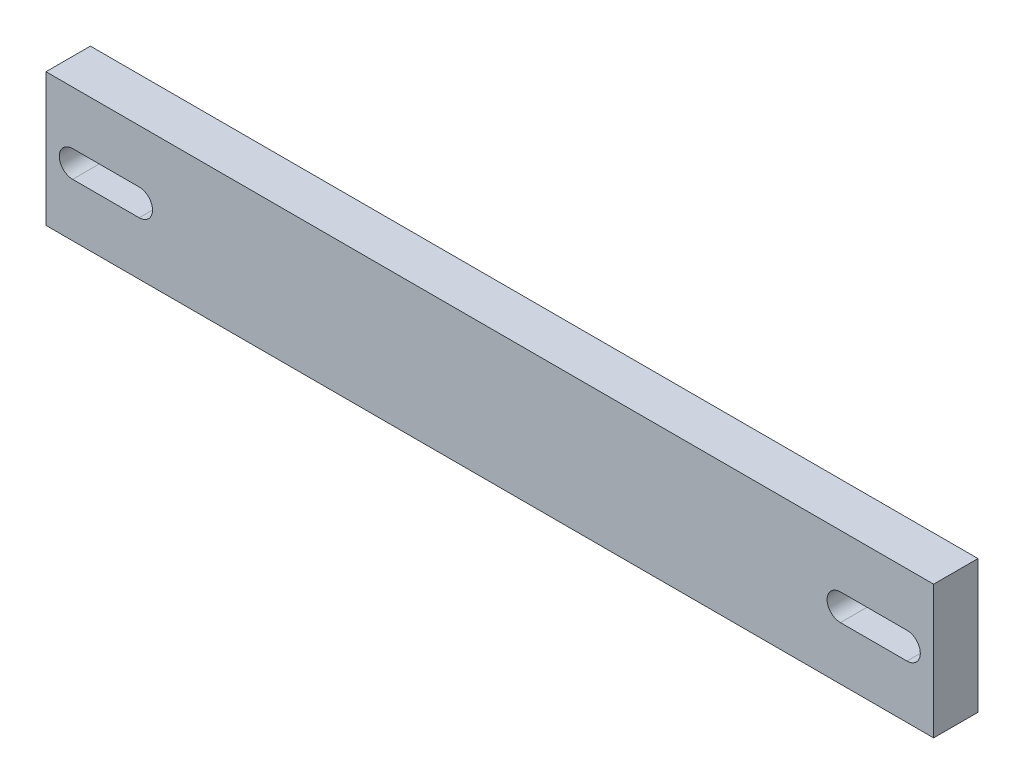
ISO-10303-21;
HEADER;
FILE_DESCRIPTION(('STEP AP214'),'2;1');
FILE_NAME('part.step','',(''),(''),'','','');
FILE_SCHEMA(('AUTOMOTIVE_DESIGN { 1 0 10303 214 1 1 1 1 }'));
ENDSEC;
DATA;
#1=APPLICATION_CONTEXT('core data for automotive mechanical design processes');
#2=APPLICATION_PROTOCOL_DEFINITION('international standard','automotive_design',2000,#1);
#3=PRODUCT_CONTEXT('',#1,'mechanical');
#4=PRODUCT('Part','Part','',(#3));
#5=PRODUCT_RELATED_PRODUCT_CATEGORY('part','',(#4));
#6=PRODUCT_DEFINITION_FORMATION('','',#4);
#7=PRODUCT_DEFINITION_CONTEXT('part definition',#1,'design');
#8=PRODUCT_DEFINITION('design','',#6,#7);
#9=PRODUCT_DEFINITION_SHAPE('','',#8);
#10=(LENGTH_UNIT() NAMED_UNIT(*) SI_UNIT(.MILLI.,.METRE.));
#11=(NAMED_UNIT(*) PLANE_ANGLE_UNIT() SI_UNIT($,.RADIAN.));
#12=(NAMED_UNIT(*) SI_UNIT($,.STERADIAN.) SOLID_ANGLE_UNIT());
#13=UNCERTAINTY_MEASURE_WITH_UNIT(LENGTH_MEASURE(1.E-05),#10,'distance_accuracy_value','');
#14=(GEOMETRIC_REPRESENTATION_CONTEXT(3) GLOBAL_UNCERTAINTY_ASSIGNED_CONTEXT((#13)) GLOBAL_UNIT_ASSIGNED_CONTEXT((#10,
#11,#12)) REPRESENTATION_CONTEXT('',''));
#15=CARTESIAN_POINT('',(0.,0.,0.));
#16=DIRECTION('',(0.,0.,1.));
#17=DIRECTION('',(1.,0.,0.));
#18=AXIS2_PLACEMENT_3D('',#15,#16,#17);
#19=CARTESIAN_POINT('',(0.,0.,10.));
#20=DIRECTION('',(0.,0.,-1.));
#21=DIRECTION('',(-1.,0.,0.));
#22=AXIS2_PLACEMENT_3D('',#19,#20,#21);
#23=PLANE('',#22);
#24=CARTESIAN_POINT('',(-94.,0.,10.));
#25=DIRECTION('',(0.,0.,1.));
#26=DIRECTION('',(1.,0.,0.));
#27=AXIS2_PLACEMENT_3D('',#24,#25,#26);
#28=CIRCLE('',#27,3.);
#29=CARTESIAN_POINT('',(-94.,3.,10.));
#30=VERTEX_POINT('',#29);
#31=CARTESIAN_POINT('',(-94.,-3.,10.));
#32=VERTEX_POINT('',#31);
#33=EDGE_CURVE('E165',#30,#32,#28,.T.);
#34=ORIENTED_EDGE('',*,*,#33,.F.);
#35=DIRECTION('',(-1.,0.,0.));
#36=VECTOR('',#35,1.);
#37=CARTESIAN_POINT('',(-94.,3.,10.));
#38=LINE('',#37,#36);
#39=CARTESIAN_POINT('',(-79.,3.,10.));
#40=VERTEX_POINT('',#39);
#41=EDGE_CURVE('E173',#40,#30,#38,.T.);
#42=ORIENTED_EDGE('',*,*,#41,.F.);
#43=CARTESIAN_POINT('',(-79.,0.,10.));
#44=DIRECTION('',(0.,0.,1.));
#45=DIRECTION('',(1.,0.,0.));
#46=AXIS2_PLACEMENT_3D('',#43,#44,#45);
#47=CIRCLE('',#46,3.);
#48=CARTESIAN_POINT('',(-79.,-3.,10.));
#49=VERTEX_POINT('',#48);
#50=EDGE_CURVE('E170',#49,#40,#47,.T.);
#51=ORIENTED_EDGE('',*,*,#50,.F.);
#52=DIRECTION('',(1.,0.,0.));
#53=VECTOR('',#52,1.);
#54=CARTESIAN_POINT('',(-94.,-3.,10.));
#55=LINE('',#54,#53);
#56=EDGE_CURVE('E167',#32,#49,#55,.T.);
#57=ORIENTED_EDGE('',*,*,#56,.F.);
#58=EDGE_LOOP('',(#34,#42,#51,#57));
#59=FACE_BOUND('',#58,.T.);
#60=DIRECTION('',(0.,1.,0.));
#61=VECTOR('',#60,1.);
#62=CARTESIAN_POINT('',(100.,-15.,10.));
#63=LINE('',#62,#61);
#64=CARTESIAN_POINT('',(100.,-15.,10.));
#65=VERTEX_POINT('',#64);
#66=CARTESIAN_POINT('',(100.,15.,10.));
#67=VERTEX_POINT('',#66);
#68=EDGE_CURVE('E196',#65,#67,#63,.T.);
#69=ORIENTED_EDGE('',*,*,#68,.T.);
#70=DIRECTION('',(-1.,0.,0.));
#71=VECTOR('',#70,1.);
#72=CARTESIAN_POINT('',(-100.,15.,10.));
#73=LINE('',#72,#71);
#74=CARTESIAN_POINT('',(-100.,15.,10.));
#75=VERTEX_POINT('',#74);
#76=EDGE_CURVE('E199',#67,#75,#73,.T.);
#77=ORIENTED_EDGE('',*,*,#76,.T.);
#78=DIRECTION('',(0.,-1.,0.));
#79=VECTOR('',#78,1.);
#80=CARTESIAN_POINT('',(-100.,-15.,10.));
#81=LINE('',#80,#79);
#82=CARTESIAN_POINT('',(-100.,-15.,10.));
#83=VERTEX_POINT('',#82);
#84=EDGE_CURVE('E202',#75,#83,#81,.T.);
#85=ORIENTED_EDGE('',*,*,#84,.T.);
#86=DIRECTION('',(1.,0.,0.));
#87=VECTOR('',#86,1.);
#88=CARTESIAN_POINT('',(-100.,-15.,10.));
#89=LINE('',#88,#87);
#90=EDGE_CURVE('E204',#83,#65,#89,.T.);
#91=ORIENTED_EDGE('',*,*,#90,.T.);
#92=EDGE_LOOP('',(#69,#77,#85,#91));
#93=FACE_BOUND('',#92,.T.);
#94=CARTESIAN_POINT('',(94.,0.,10.));
#95=DIRECTION('',(0.,0.,1.));
#96=DIRECTION('',(-1.,0.,0.));
#97=AXIS2_PLACEMENT_3D('',#94,#95,#96);
#98=CIRCLE('',#97,3.);
#99=CARTESIAN_POINT('',(94.,-3.,10.));
#100=VERTEX_POINT('',#99);
#101=CARTESIAN_POINT('',(94.,3.,10.));
#102=VERTEX_POINT('',#101);
#103=EDGE_CURVE('E129',#100,#102,#98,.T.);
#104=ORIENTED_EDGE('',*,*,#103,.F.);
#105=DIRECTION('',(1.,0.,0.));
#106=VECTOR('',#105,1.);
#107=CARTESIAN_POINT('',(94.,-3.,10.));
#108=LINE('',#107,#106);
#109=CARTESIAN_POINT('',(79.,-3.,10.));
#110=VERTEX_POINT('',#109);
#111=EDGE_CURVE('E151',#110,#100,#108,.T.);
#112=ORIENTED_EDGE('',*,*,#111,.F.);
#113=CARTESIAN_POINT('',(79.,0.,10.));
#114=DIRECTION('',(0.,0.,1.));
#115=DIRECTION('',(-1.,0.,0.));
#116=AXIS2_PLACEMENT_3D('',#113,#114,#115);
#117=CIRCLE('',#116,3.);
#118=CARTESIAN_POINT('',(79.,3.,10.));
#119=VERTEX_POINT('',#118);
#120=EDGE_CURVE('E149',#119,#110,#117,.T.);
#121=ORIENTED_EDGE('',*,*,#120,.F.);
#122=DIRECTION('',(-1.,0.,0.));
#123=VECTOR('',#122,1.);
#124=CARTESIAN_POINT('',(94.,3.,10.));
#125=LINE('',#124,#123);
#126=EDGE_CURVE('E137',#102,#119,#125,.T.);
#127=ORIENTED_EDGE('',*,*,#126,.F.);
#128=EDGE_LOOP('',(#104,#112,#121,#127));
#129=FACE_BOUND('',#128,.T.);
#130=ADVANCED_FACE('F40',(#59,#93,#129),#23,.F.);
#131=CARTESIAN_POINT('',(0.,0.,0.));
#132=DIRECTION('',(0.,0.,-1.));
#133=DIRECTION('',(-1.,0.,0.));
#134=AXIS2_PLACEMENT_3D('',#131,#132,#133);
#135=PLANE('',#134);
#136=DIRECTION('',(0.,1.,0.));
#137=VECTOR('',#136,1.);
#138=CARTESIAN_POINT('',(100.,-15.,0.));
#139=LINE('',#138,#137);
#140=CARTESIAN_POINT('',(100.,-15.,0.));
#141=VERTEX_POINT('',#140);
#142=CARTESIAN_POINT('',(100.,15.,0.));
#143=VERTEX_POINT('',#142);
#144=EDGE_CURVE('E195',#141,#143,#139,.T.);
#145=ORIENTED_EDGE('',*,*,#144,.F.);
#146=DIRECTION('',(1.,0.,0.));
#147=VECTOR('',#146,1.);
#148=CARTESIAN_POINT('',(-100.,-15.,0.));
#149=LINE('',#148,#147);
#150=CARTESIAN_POINT('',(-100.,-15.,0.));
#151=VERTEX_POINT('',#150);
#152=EDGE_CURVE('E200',#151,#141,#149,.T.);
#153=ORIENTED_EDGE('',*,*,#152,.F.);
#154=DIRECTION('',(0.,-1.,0.));
#155=VECTOR('',#154,1.);
#156=CARTESIAN_POINT('',(-100.,-15.,0.));
#157=LINE('',#156,#155);
#158=CARTESIAN_POINT('',(-100.,15.,0.));
#159=VERTEX_POINT('',#158);
#160=EDGE_CURVE('E211',#159,#151,#157,.T.);
#161=ORIENTED_EDGE('',*,*,#160,.F.);
#162=DIRECTION('',(-1.,0.,0.));
#163=VECTOR('',#162,1.);
#164=CARTESIAN_POINT('',(-100.,15.,0.));
#165=LINE('',#164,#163);
#166=EDGE_CURVE('E209',#143,#159,#165,.T.);
#167=ORIENTED_EDGE('',*,*,#166,.F.);
#168=EDGE_LOOP('',(#145,#153,#161,#167));
#169=FACE_BOUND('',#168,.T.);
#170=DIRECTION('',(-1.,0.,0.));
#171=VECTOR('',#170,1.);
#172=CARTESIAN_POINT('',(-94.,3.,0.));
#173=LINE('',#172,#171);
#174=CARTESIAN_POINT('',(-79.,3.,0.));
#175=VERTEX_POINT('',#174);
#176=CARTESIAN_POINT('',(-94.,3.,0.));
#177=VERTEX_POINT('',#176);
#178=EDGE_CURVE('E168',#175,#177,#173,.T.);
#179=ORIENTED_EDGE('',*,*,#178,.T.);
#180=CARTESIAN_POINT('',(-94.,0.,0.));
#181=DIRECTION('',(0.,0.,1.));
#182=DIRECTION('',(1.,0.,0.));
#183=AXIS2_PLACEMENT_3D('',#180,#181,#182);
#184=CIRCLE('',#183,3.);
#185=CARTESIAN_POINT('',(-94.,-3.,0.));
#186=VERTEX_POINT('',#185);
#187=EDGE_CURVE('E145',#177,#186,#184,.T.);
#188=ORIENTED_EDGE('',*,*,#187,.T.);
#189=DIRECTION('',(1.,0.,0.));
#190=VECTOR('',#189,1.);
#191=CARTESIAN_POINT('',(-94.,-3.,0.));
#192=LINE('',#191,#190);
#193=CARTESIAN_POINT('',(-79.,-3.,0.));
#194=VERTEX_POINT('',#193);
#195=EDGE_CURVE('E178',#186,#194,#192,.T.);
#196=ORIENTED_EDGE('',*,*,#195,.T.);
#197=CARTESIAN_POINT('',(-79.,0.,0.));
#198=DIRECTION('',(0.,0.,1.));
#199=DIRECTION('',(1.,0.,0.));
#200=AXIS2_PLACEMENT_3D('',#197,#198,#199);
#201=CIRCLE('',#200,3.);
#202=EDGE_CURVE('E181',#194,#175,#201,.T.);
#203=ORIENTED_EDGE('',*,*,#202,.T.);
#204=EDGE_LOOP('',(#179,#188,#196,#203));
#205=FACE_BOUND('',#204,.T.);
#206=DIRECTION('',(1.,0.,0.));
#207=VECTOR('',#206,1.);
#208=CARTESIAN_POINT('',(94.,-3.,0.));
#209=LINE('',#208,#207);
#210=CARTESIAN_POINT('',(79.,-3.,0.));
#211=VERTEX_POINT('',#210);
#212=CARTESIAN_POINT('',(94.,-3.,0.));
#213=VERTEX_POINT('',#212);
#214=EDGE_CURVE('E138',#211,#213,#209,.T.);
#215=ORIENTED_EDGE('',*,*,#214,.T.);
#216=CARTESIAN_POINT('',(94.,0.,0.));
#217=DIRECTION('',(0.,0.,1.));
#218=DIRECTION('',(-1.,0.,0.));
#219=AXIS2_PLACEMENT_3D('',#216,#217,#218);
#220=CIRCLE('',#219,3.);
#221=CARTESIAN_POINT('',(94.,3.,0.));
#222=VERTEX_POINT('',#221);
#223=EDGE_CURVE('E63',#213,#222,#220,.T.);
#224=ORIENTED_EDGE('',*,*,#223,.T.);
#225=DIRECTION('',(-1.,0.,0.));
#226=VECTOR('',#225,1.);
#227=CARTESIAN_POINT('',(94.,3.,0.));
#228=LINE('',#227,#226);
#229=CARTESIAN_POINT('',(79.,3.,0.));
#230=VERTEX_POINT('',#229);
#231=EDGE_CURVE('E144',#222,#230,#228,.T.);
#232=ORIENTED_EDGE('',*,*,#231,.T.);
#233=CARTESIAN_POINT('',(79.,0.,0.));
#234=DIRECTION('',(0.,0.,1.));
#235=DIRECTION('',(-1.,0.,0.));
#236=AXIS2_PLACEMENT_3D('',#233,#234,#235);
#237=CIRCLE('',#236,3.);
#238=EDGE_CURVE('E157',#230,#211,#237,.T.);
#239=ORIENTED_EDGE('',*,*,#238,.T.);
#240=EDGE_LOOP('',(#215,#224,#232,#239));
#241=FACE_BOUND('',#240,.T.);
#242=ADVANCED_FACE('F229',(#169,#205,#241),#135,.T.);
#243=CARTESIAN_POINT('',(100.,-15.,10.));
#244=DIRECTION('',(-1.,0.,0.));
#245=DIRECTION('',(0.,0.,1.));
#246=AXIS2_PLACEMENT_3D('',#243,#244,#245);
#247=PLANE('',#246);
#248=ORIENTED_EDGE('',*,*,#144,.T.);
#249=DIRECTION('',(0.,0.,-1.));
#250=VECTOR('',#249,1.);
#251=CARTESIAN_POINT('',(100.,15.,10.));
#252=LINE('',#251,#250);
#253=EDGE_CURVE('E11',#67,#143,#252,.T.);
#254=ORIENTED_EDGE('',*,*,#253,.F.);
#255=ORIENTED_EDGE('',*,*,#68,.F.);
#256=DIRECTION('',(0.,0.,-1.));
#257=VECTOR('',#256,1.);
#258=CARTESIAN_POINT('',(100.,-15.,10.));
#259=LINE('',#258,#257);
#260=EDGE_CURVE('E206',#65,#141,#259,.T.);
#261=ORIENTED_EDGE('',*,*,#260,.T.);
#262=EDGE_LOOP('',(#248,#254,#255,#261));
#263=FACE_BOUND('',#262,.T.);
#264=ADVANCED_FACE('F42',(#263),#247,.F.);
#265=CARTESIAN_POINT('',(-100.,15.,10.));
#266=DIRECTION('',(0.,-1.,0.));
#267=DIRECTION('',(0.,0.,-1.));
#268=AXIS2_PLACEMENT_3D('',#265,#266,#267);
#269=PLANE('',#268);
#270=ORIENTED_EDGE('',*,*,#166,.T.);
#271=DIRECTION('',(0.,0.,-1.));
#272=VECTOR('',#271,1.);
#273=CARTESIAN_POINT('',(-100.,15.,10.));
#274=LINE('',#273,#272);
#275=EDGE_CURVE('E48',#75,#159,#274,.T.);
#276=ORIENTED_EDGE('',*,*,#275,.F.);
#277=ORIENTED_EDGE('',*,*,#76,.F.);
#278=ORIENTED_EDGE('',*,*,#253,.T.);
#279=EDGE_LOOP('',(#270,#276,#277,#278));
#280=FACE_BOUND('',#279,.T.);
#281=ADVANCED_FACE('F239',(#280),#269,.F.);
#282=CARTESIAN_POINT('',(-100.,-15.,10.));
#283=DIRECTION('',(1.,0.,0.));
#284=DIRECTION('',(0.,0.,-1.));
#285=AXIS2_PLACEMENT_3D('',#282,#283,#284);
#286=PLANE('',#285);
#287=ORIENTED_EDGE('',*,*,#160,.T.);
#288=DIRECTION('',(0.,0.,-1.));
#289=VECTOR('',#288,1.);
#290=CARTESIAN_POINT('',(-100.,-15.,10.));
#291=LINE('',#290,#289);
#292=EDGE_CURVE('E216',#83,#151,#291,.T.);
#293=ORIENTED_EDGE('',*,*,#292,.F.);
#294=ORIENTED_EDGE('',*,*,#84,.F.);
#295=ORIENTED_EDGE('',*,*,#275,.T.);
#296=EDGE_LOOP('',(#287,#293,#294,#295));
#297=FACE_BOUND('',#296,.T.);
#298=ADVANCED_FACE('F223',(#297),#286,.F.);
#299=CARTESIAN_POINT('',(-100.,-15.,10.));
#300=DIRECTION('',(0.,1.,0.));
#301=DIRECTION('',(0.,0.,1.));
#302=AXIS2_PLACEMENT_3D('',#299,#300,#301);
#303=PLANE('',#302);
#304=ORIENTED_EDGE('',*,*,#152,.T.);
#305=ORIENTED_EDGE('',*,*,#260,.F.);
#306=ORIENTED_EDGE('',*,*,#90,.F.);
#307=ORIENTED_EDGE('',*,*,#292,.T.);
#308=EDGE_LOOP('',(#304,#305,#306,#307));
#309=FACE_BOUND('',#308,.T.);
#310=ADVANCED_FACE('F233',(#309),#303,.F.);
#311=CARTESIAN_POINT('',(-94.,0.,10.));
#312=DIRECTION('',(0.,0.,-1.));
#313=DIRECTION('',(-1.,0.,0.));
#314=AXIS2_PLACEMENT_3D('',#311,#312,#313);
#315=CYLINDRICAL_SURFACE('',#314,3.);
#316=ORIENTED_EDGE('',*,*,#187,.F.);
#317=DIRECTION('',(0.,0.,-1.));
#318=VECTOR('',#317,1.);
#319=CARTESIAN_POINT('',(-94.,3.,10.));
#320=LINE('',#319,#318);
#321=EDGE_CURVE('E175',#30,#177,#320,.T.);
#322=ORIENTED_EDGE('',*,*,#321,.F.);
#323=ORIENTED_EDGE('',*,*,#33,.T.);
#324=DIRECTION('',(0.,0.,-1.));
#325=VECTOR('',#324,1.);
#326=CARTESIAN_POINT('',(-94.,-3.,10.));
#327=LINE('',#326,#325);
#328=EDGE_CURVE('E192',#32,#186,#327,.T.);
#329=ORIENTED_EDGE('',*,*,#328,.T.);
#330=EDGE_LOOP('',(#316,#322,#323,#329));
#331=FACE_BOUND('',#330,.T.);
#332=ADVANCED_FACE('F255',(#331),#315,.F.);
#333=CARTESIAN_POINT('',(-94.,-3.,10.));
#334=DIRECTION('',(0.,1.,0.));
#335=DIRECTION('',(0.,0.,1.));
#336=AXIS2_PLACEMENT_3D('',#333,#334,#335);
#337=PLANE('',#336);
#338=ORIENTED_EDGE('',*,*,#195,.F.);
#339=ORIENTED_EDGE('',*,*,#328,.F.);
#340=ORIENTED_EDGE('',*,*,#56,.T.);
#341=DIRECTION('',(0.,0.,-1.));
#342=VECTOR('',#341,1.);
#343=CARTESIAN_POINT('',(-79.,-3.,10.));
#344=LINE('',#343,#342);
#345=EDGE_CURVE('E190',#49,#194,#344,.T.);
#346=ORIENTED_EDGE('',*,*,#345,.T.);
#347=EDGE_LOOP('',(#338,#339,#340,#346));
#348=FACE_BOUND('',#347,.T.);
#349=ADVANCED_FACE('F262',(#348),#337,.T.);
#350=CARTESIAN_POINT('',(-79.,0.,10.));
#351=DIRECTION('',(0.,0.,-1.));
#352=DIRECTION('',(-1.,0.,0.));
#353=AXIS2_PLACEMENT_3D('',#350,#351,#352);
#354=CYLINDRICAL_SURFACE('',#353,3.);
#355=ORIENTED_EDGE('',*,*,#202,.F.);
#356=ORIENTED_EDGE('',*,*,#345,.F.);
#357=ORIENTED_EDGE('',*,*,#50,.T.);
#358=DIRECTION('',(0.,0.,-1.));
#359=VECTOR('',#358,1.);
#360=CARTESIAN_POINT('',(-79.,3.,10.));
#361=LINE('',#360,#359);
#362=EDGE_CURVE('E188',#40,#175,#361,.T.);
#363=ORIENTED_EDGE('',*,*,#362,.T.);
#364=EDGE_LOOP('',(#355,#356,#357,#363));
#365=FACE_BOUND('',#364,.T.);
#366=ADVANCED_FACE('F267',(#365),#354,.F.);
#367=CARTESIAN_POINT('',(-94.,3.,10.));
#368=DIRECTION('',(0.,-1.,0.));
#369=DIRECTION('',(0.,0.,-1.));
#370=AXIS2_PLACEMENT_3D('',#367,#368,#369);
#371=PLANE('',#370);
#372=ORIENTED_EDGE('',*,*,#178,.F.);
#373=ORIENTED_EDGE('',*,*,#362,.F.);
#374=ORIENTED_EDGE('',*,*,#41,.T.);
#375=ORIENTED_EDGE('',*,*,#321,.T.);
#376=EDGE_LOOP('',(#372,#373,#374,#375));
#377=FACE_BOUND('',#376,.T.);
#378=ADVANCED_FACE('F273',(#377),#371,.T.);
#379=CARTESIAN_POINT('',(94.,0.,10.));
#380=DIRECTION('',(0.,0.,-1.));
#381=DIRECTION('',(-1.,0.,0.));
#382=AXIS2_PLACEMENT_3D('',#379,#380,#381);
#383=CYLINDRICAL_SURFACE('',#382,3.);
#384=ORIENTED_EDGE('',*,*,#223,.F.);
#385=DIRECTION('',(0.,0.,-1.));
#386=VECTOR('',#385,1.);
#387=CARTESIAN_POINT('',(94.,-3.,10.));
#388=LINE('',#387,#386);
#389=EDGE_CURVE('E133',#100,#213,#388,.T.);
#390=ORIENTED_EDGE('',*,*,#389,.F.);
#391=ORIENTED_EDGE('',*,*,#103,.T.);
#392=DIRECTION('',(0.,0.,-1.));
#393=VECTOR('',#392,1.);
#394=CARTESIAN_POINT('',(94.,3.,10.));
#395=LINE('',#394,#393);
#396=EDGE_CURVE('E132',#102,#222,#395,.T.);
#397=ORIENTED_EDGE('',*,*,#396,.T.);
#398=EDGE_LOOP('',(#384,#390,#391,#397));
#399=FACE_BOUND('',#398,.T.);
#400=ADVANCED_FACE('F131',(#399),#383,.F.);
#401=CARTESIAN_POINT('',(94.,3.,10.));
#402=DIRECTION('',(0.,-1.,0.));
#403=DIRECTION('',(0.,0.,-1.));
#404=AXIS2_PLACEMENT_3D('',#401,#402,#403);
#405=PLANE('',#404);
#406=ORIENTED_EDGE('',*,*,#231,.F.);
#407=ORIENTED_EDGE('',*,*,#396,.F.);
#408=ORIENTED_EDGE('',*,*,#126,.T.);
#409=DIRECTION('',(0.,0.,-1.));
#410=VECTOR('',#409,1.);
#411=CARTESIAN_POINT('',(79.,3.,10.));
#412=LINE('',#411,#410);
#413=EDGE_CURVE('E146',#119,#230,#412,.T.);
#414=ORIENTED_EDGE('',*,*,#413,.T.);
#415=EDGE_LOOP('',(#406,#407,#408,#414));
#416=FACE_BOUND('',#415,.T.);
#417=ADVANCED_FACE('F141',(#416),#405,.T.);
#418=CARTESIAN_POINT('',(79.,0.,10.));
#419=DIRECTION('',(0.,0.,-1.));
#420=DIRECTION('',(-1.,0.,0.));
#421=AXIS2_PLACEMENT_3D('',#418,#419,#420);
#422=CYLINDRICAL_SURFACE('',#421,3.);
#423=ORIENTED_EDGE('',*,*,#238,.F.);
#424=ORIENTED_EDGE('',*,*,#413,.F.);
#425=ORIENTED_EDGE('',*,*,#120,.T.);
#426=DIRECTION('',(0.,0.,-1.));
#427=VECTOR('',#426,1.);
#428=CARTESIAN_POINT('',(79.,-3.,10.));
#429=LINE('',#428,#427);
#430=EDGE_CURVE('E55',#110,#211,#429,.T.);
#431=ORIENTED_EDGE('',*,*,#430,.T.);
#432=EDGE_LOOP('',(#423,#424,#425,#431));
#433=FACE_BOUND('',#432,.T.);
#434=ADVANCED_FACE('F292',(#433),#422,.F.);
#435=CARTESIAN_POINT('',(94.,-3.,10.));
#436=DIRECTION('',(0.,1.,0.));
#437=DIRECTION('',(0.,0.,1.));
#438=AXIS2_PLACEMENT_3D('',#435,#436,#437);
#439=PLANE('',#438);
#440=ORIENTED_EDGE('',*,*,#214,.F.);
#441=ORIENTED_EDGE('',*,*,#430,.F.);
#442=ORIENTED_EDGE('',*,*,#111,.T.);
#443=ORIENTED_EDGE('',*,*,#389,.T.);
#444=EDGE_LOOP('',(#440,#441,#442,#443));
#445=FACE_BOUND('',#444,.T.);
#446=ADVANCED_FACE('F295',(#445),#439,.T.);
#447=CLOSED_SHELL('',(#130,#242,#264,#281,#298,#310,#332,#349,#366,#378,#400,#417,#434,#446));
#448=MANIFOLD_SOLID_BREP('B2',#447);
#449=ADVANCED_BREP_SHAPE_REPRESENTATION('',(#18,#448),#14);
#450=SHAPE_DEFINITION_REPRESENTATION(#9,#449);
ENDSEC;
END-ISO-10303-21;
